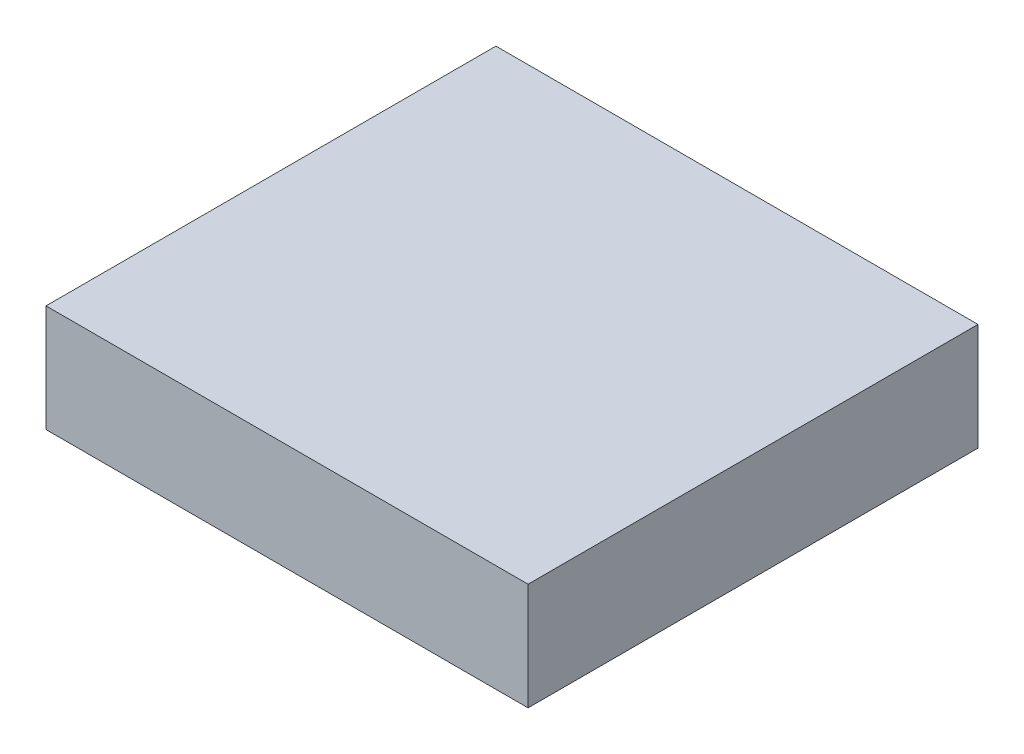
ISO-10303-21;
HEADER;
FILE_DESCRIPTION(('STEP AP214'),'2;1');
FILE_NAME('part.step','',(''),(''),'','','');
FILE_SCHEMA(('AUTOMOTIVE_DESIGN { 1 0 10303 214 1 1 1 1 }'));
ENDSEC;
DATA;
#1=APPLICATION_CONTEXT('core data for automotive mechanical design processes');
#2=APPLICATION_PROTOCOL_DEFINITION('international standard','automotive_design',2000,#1);
#3=PRODUCT_CONTEXT('',#1,'mechanical');
#4=PRODUCT('Part','Part','',(#3));
#5=PRODUCT_RELATED_PRODUCT_CATEGORY('part','',(#4));
#6=PRODUCT_DEFINITION_FORMATION('','',#4);
#7=PRODUCT_DEFINITION_CONTEXT('part definition',#1,'design');
#8=PRODUCT_DEFINITION('design','',#6,#7);
#9=PRODUCT_DEFINITION_SHAPE('','',#8);
#10=(LENGTH_UNIT() NAMED_UNIT(*) SI_UNIT(.MILLI.,.METRE.));
#11=(NAMED_UNIT(*) PLANE_ANGLE_UNIT() SI_UNIT($,.RADIAN.));
#12=(NAMED_UNIT(*) SI_UNIT($,.STERADIAN.) SOLID_ANGLE_UNIT());
#13=UNCERTAINTY_MEASURE_WITH_UNIT(LENGTH_MEASURE(1.E-05),#10,'distance_accuracy_value','');
#14=(GEOMETRIC_REPRESENTATION_CONTEXT(3) GLOBAL_UNCERTAINTY_ASSIGNED_CONTEXT((#13)) GLOBAL_UNIT_ASSIGNED_CONTEXT((#10,
#11,#12)) REPRESENTATION_CONTEXT('',''));
#15=CARTESIAN_POINT('',(0.,0.,0.));
#16=DIRECTION('',(0.,0.,1.));
#17=DIRECTION('',(1.,0.,0.));
#18=AXIS2_PLACEMENT_3D('',#15,#16,#17);
#19=CARTESIAN_POINT('',(22.5,10.,21.));
#20=DIRECTION('',(-1.,0.,0.));
#21=DIRECTION('',(0.,0.,1.));
#22=AXIS2_PLACEMENT_3D('',#19,#20,#21);
#23=PLANE('',#22);
#24=DIRECTION('',(0.,0.,-1.));
#25=VECTOR('',#24,1.);
#26=CARTESIAN_POINT('',(22.5,0.,21.));
#27=LINE('',#26,#25);
#28=CARTESIAN_POINT('',(22.5,0.,21.));
#29=VERTEX_POINT('',#28);
#30=CARTESIAN_POINT('',(22.5,0.,-21.));
#31=VERTEX_POINT('',#30);
#32=EDGE_CURVE('E98',#29,#31,#27,.T.);
#33=ORIENTED_EDGE('',*,*,#32,.T.);
#34=DIRECTION('',(0.,-1.,0.));
#35=VECTOR('',#34,1.);
#36=CARTESIAN_POINT('',(22.5,10.,-21.));
#37=LINE('',#36,#35);
#38=CARTESIAN_POINT('',(22.5,10.,-21.));
#39=VERTEX_POINT('',#38);
#40=EDGE_CURVE('E11',#39,#31,#37,.T.);
#41=ORIENTED_EDGE('',*,*,#40,.F.);
#42=DIRECTION('',(0.,0.,-1.));
#43=VECTOR('',#42,1.);
#44=CARTESIAN_POINT('',(22.5,10.,21.));
#45=LINE('',#44,#43);
#46=CARTESIAN_POINT('',(22.5,10.,21.));
#47=VERTEX_POINT('',#46);
#48=EDGE_CURVE('E86',#47,#39,#45,.T.);
#49=ORIENTED_EDGE('',*,*,#48,.F.);
#50=DIRECTION('',(0.,-1.,0.));
#51=VECTOR('',#50,1.);
#52=CARTESIAN_POINT('',(22.5,10.,21.));
#53=LINE('',#52,#51);
#54=EDGE_CURVE('E94',#47,#29,#53,.T.);
#55=ORIENTED_EDGE('',*,*,#54,.T.);
#56=EDGE_LOOP('',(#33,#41,#49,#55));
#57=FACE_BOUND('',#56,.T.);
#58=ADVANCED_FACE('F35',(#57),#23,.F.);
#59=CARTESIAN_POINT('',(-22.5,10.,-21.));
#60=DIRECTION('',(0.,0.,1.));
#61=DIRECTION('',(1.,0.,0.));
#62=AXIS2_PLACEMENT_3D('',#59,#60,#61);
#63=PLANE('',#62);
#64=DIRECTION('',(-1.,0.,0.));
#65=VECTOR('',#64,1.);
#66=CARTESIAN_POINT('',(-22.5,0.,-21.));
#67=LINE('',#66,#65);
#68=CARTESIAN_POINT('',(-22.5,0.,-21.));
#69=VERTEX_POINT('',#68);
#70=EDGE_CURVE('E90',#31,#69,#67,.T.);
#71=ORIENTED_EDGE('',*,*,#70,.T.);
#72=DIRECTION('',(0.,-1.,0.));
#73=VECTOR('',#72,1.);
#74=CARTESIAN_POINT('',(-22.5,10.,-21.));
#75=LINE('',#74,#73);
#76=CARTESIAN_POINT('',(-22.5,10.,-21.));
#77=VERTEX_POINT('',#76);
#78=EDGE_CURVE('E43',#77,#69,#75,.T.);
#79=ORIENTED_EDGE('',*,*,#78,.F.);
#80=DIRECTION('',(-1.,0.,0.));
#81=VECTOR('',#80,1.);
#82=CARTESIAN_POINT('',(-22.5,10.,-21.));
#83=LINE('',#82,#81);
#84=EDGE_CURVE('E81',#39,#77,#83,.T.);
#85=ORIENTED_EDGE('',*,*,#84,.F.);
#86=ORIENTED_EDGE('',*,*,#40,.T.);
#87=EDGE_LOOP('',(#71,#79,#85,#86));
#88=FACE_BOUND('',#87,.T.);
#89=ADVANCED_FACE('F89',(#88),#63,.F.);
#90=CARTESIAN_POINT('',(-22.5,10.,21.));
#91=DIRECTION('',(1.,0.,0.));
#92=DIRECTION('',(0.,0.,-1.));
#93=AXIS2_PLACEMENT_3D('',#90,#91,#92);
#94=PLANE('',#93);
#95=DIRECTION('',(0.,0.,1.));
#96=VECTOR('',#95,1.);
#97=CARTESIAN_POINT('',(-22.5,0.,21.));
#98=LINE('',#97,#96);
#99=CARTESIAN_POINT('',(-22.5,0.,21.));
#100=VERTEX_POINT('',#99);
#101=EDGE_CURVE('E68',#69,#100,#98,.T.);
#102=ORIENTED_EDGE('',*,*,#101,.T.);
#103=DIRECTION('',(0.,-1.,0.));
#104=VECTOR('',#103,1.);
#105=CARTESIAN_POINT('',(-22.5,10.,21.));
#106=LINE('',#105,#104);
#107=CARTESIAN_POINT('',(-22.5,10.,21.));
#108=VERTEX_POINT('',#107);
#109=EDGE_CURVE('E91',#108,#100,#106,.T.);
#110=ORIENTED_EDGE('',*,*,#109,.F.);
#111=DIRECTION('',(0.,0.,1.));
#112=VECTOR('',#111,1.);
#113=CARTESIAN_POINT('',(-22.5,10.,21.));
#114=LINE('',#113,#112);
#115=EDGE_CURVE('E84',#77,#108,#114,.T.);
#116=ORIENTED_EDGE('',*,*,#115,.F.);
#117=ORIENTED_EDGE('',*,*,#78,.T.);
#118=EDGE_LOOP('',(#102,#110,#116,#117));
#119=FACE_BOUND('',#118,.T.);
#120=ADVANCED_FACE('F92',(#119),#94,.F.);
#121=CARTESIAN_POINT('',(-22.5,10.,21.));
#122=DIRECTION('',(0.,0.,-1.));
#123=DIRECTION('',(-1.,0.,0.));
#124=AXIS2_PLACEMENT_3D('',#121,#122,#123);
#125=PLANE('',#124);
#126=DIRECTION('',(1.,0.,0.));
#127=VECTOR('',#126,1.);
#128=CARTESIAN_POINT('',(-22.5,0.,21.));
#129=LINE('',#128,#127);
#130=EDGE_CURVE('E74',#100,#29,#129,.T.);
#131=ORIENTED_EDGE('',*,*,#130,.T.);
#132=ORIENTED_EDGE('',*,*,#54,.F.);
#133=DIRECTION('',(1.,0.,0.));
#134=VECTOR('',#133,1.);
#135=CARTESIAN_POINT('',(-22.5,10.,21.));
#136=LINE('',#135,#134);
#137=EDGE_CURVE('E51',#108,#47,#136,.T.);
#138=ORIENTED_EDGE('',*,*,#137,.F.);
#139=ORIENTED_EDGE('',*,*,#109,.T.);
#140=EDGE_LOOP('',(#131,#132,#138,#139));
#141=FACE_BOUND('',#140,.T.);
#142=ADVANCED_FACE('F105',(#141),#125,.F.);
#143=CARTESIAN_POINT('',(0.,10.,0.));
#144=DIRECTION('',(0.,-1.,0.));
#145=DIRECTION('',(0.,0.,-1.));
#146=AXIS2_PLACEMENT_3D('',#143,#144,#145);
#147=PLANE('',#146);
#148=ORIENTED_EDGE('',*,*,#48,.T.);
#149=ORIENTED_EDGE('',*,*,#84,.T.);
#150=ORIENTED_EDGE('',*,*,#115,.T.);
#151=ORIENTED_EDGE('',*,*,#137,.T.);
#152=EDGE_LOOP('',(#148,#149,#150,#151));
#153=FACE_BOUND('',#152,.T.);
#154=ADVANCED_FACE('F82',(#153),#147,.F.);
#155=CARTESIAN_POINT('',(0.,0.,0.));
#156=DIRECTION('',(0.,-1.,0.));
#157=DIRECTION('',(0.,0.,-1.));
#158=AXIS2_PLACEMENT_3D('',#155,#156,#157);
#159=PLANE('',#158);
#160=ORIENTED_EDGE('',*,*,#32,.F.);
#161=ORIENTED_EDGE('',*,*,#130,.F.);
#162=ORIENTED_EDGE('',*,*,#101,.F.);
#163=ORIENTED_EDGE('',*,*,#70,.F.);
#164=EDGE_LOOP('',(#160,#161,#162,#163));
#165=FACE_BOUND('',#164,.T.);
#166=ADVANCED_FACE('F108',(#165),#159,.T.);
#167=CLOSED_SHELL('',(#58,#89,#120,#142,#154,#166));
#168=MANIFOLD_SOLID_BREP('B2',#167);
#169=ADVANCED_BREP_SHAPE_REPRESENTATION('',(#18,#168),#14);
#170=SHAPE_DEFINITION_REPRESENTATION(#9,#169);
ENDSEC;
END-ISO-10303-21;
